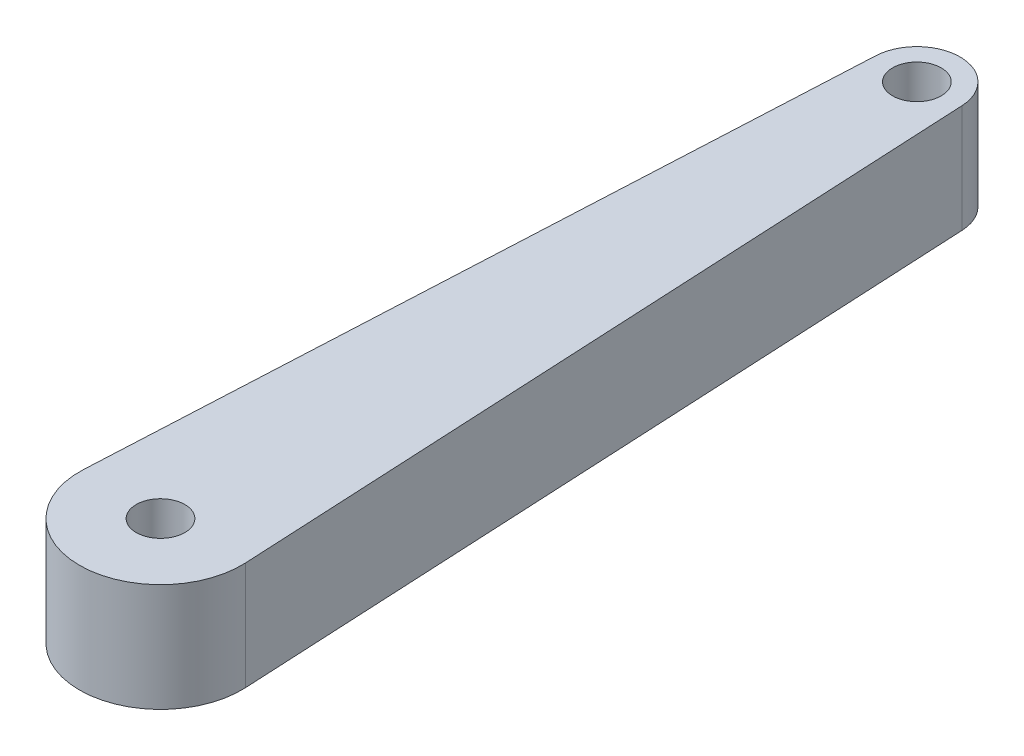
ISO-10303-21;
HEADER;
FILE_DESCRIPTION(('STEP AP214'),'2;1');
FILE_NAME('part.step','',(''),(''),'','','');
FILE_SCHEMA(('AUTOMOTIVE_DESIGN { 1 0 10303 214 1 1 1 1 }'));
ENDSEC;
DATA;
#1=APPLICATION_CONTEXT('core data for automotive mechanical design processes');
#2=APPLICATION_PROTOCOL_DEFINITION('international standard','automotive_design',2000,#1);
#3=PRODUCT_CONTEXT('',#1,'mechanical');
#4=PRODUCT('Part','Part','',(#3));
#5=PRODUCT_RELATED_PRODUCT_CATEGORY('part','',(#4));
#6=PRODUCT_DEFINITION_FORMATION('','',#4);
#7=PRODUCT_DEFINITION_CONTEXT('part definition',#1,'design');
#8=PRODUCT_DEFINITION('design','',#6,#7);
#9=PRODUCT_DEFINITION_SHAPE('','',#8);
#10=(LENGTH_UNIT() NAMED_UNIT(*) SI_UNIT(.MILLI.,.METRE.));
#11=(NAMED_UNIT(*) PLANE_ANGLE_UNIT() SI_UNIT($,.RADIAN.));
#12=(NAMED_UNIT(*) SI_UNIT($,.STERADIAN.) SOLID_ANGLE_UNIT());
#13=UNCERTAINTY_MEASURE_WITH_UNIT(LENGTH_MEASURE(1.E-05),#10,'distance_accuracy_value','');
#14=(GEOMETRIC_REPRESENTATION_CONTEXT(3) GLOBAL_UNCERTAINTY_ASSIGNED_CONTEXT((#13)) GLOBAL_UNIT_ASSIGNED_CONTEXT((#10,
#11,#12)) REPRESENTATION_CONTEXT('',''));
#15=CARTESIAN_POINT('',(0.,0.,0.));
#16=DIRECTION('',(0.,0.,1.));
#17=DIRECTION('',(1.,0.,0.));
#18=AXIS2_PLACEMENT_3D('',#15,#16,#17);
#19=CARTESIAN_POINT('',(-3.74530956664466,5.,-0.1875));
#20=DIRECTION('',(-0.998749217771909,0.,-0.05));
#21=DIRECTION('',(-0.05,0.,0.998749217771909));
#22=AXIS2_PLACEMENT_3D('',#19,#20,#21);
#23=PLANE('',#22);
#24=DIRECTION('',(0.05,0.,-0.998749217771909));
#25=VECTOR('',#24,1.);
#26=CARTESIAN_POINT('',(-3.74530956664466,0.,-0.1875));
#27=LINE('',#26,#25);
#28=CARTESIAN_POINT('',(-3.74530956664466,0.,-0.1875));
#29=VERTEX_POINT('',#28);
#30=CARTESIAN_POINT('',(-1.99749843554382,0.,-35.1));
#31=VERTEX_POINT('',#30);
#32=EDGE_CURVE('E117',#29,#31,#27,.T.);
#33=ORIENTED_EDGE('',*,*,#32,.F.);
#34=DIRECTION('',(0.,-1.,0.));
#35=VECTOR('',#34,1.);
#36=CARTESIAN_POINT('',(-3.74530956664466,5.,-0.1875));
#37=LINE('',#36,#35);
#38=CARTESIAN_POINT('',(-3.74530956664466,5.,-0.1875));
#39=VERTEX_POINT('',#38);
#40=EDGE_CURVE('E11',#39,#29,#37,.T.);
#41=ORIENTED_EDGE('',*,*,#40,.F.);
#42=DIRECTION('',(0.05,0.,-0.998749217771909));
#43=VECTOR('',#42,1.);
#44=CARTESIAN_POINT('',(-3.74530956664466,5.,-0.1875));
#45=LINE('',#44,#43);
#46=CARTESIAN_POINT('',(-1.99749843554382,5.,-35.1));
#47=VERTEX_POINT('',#46);
#48=EDGE_CURVE('E93',#39,#47,#45,.T.);
#49=ORIENTED_EDGE('',*,*,#48,.T.);
#50=DIRECTION('',(0.,-1.,0.));
#51=VECTOR('',#50,1.);
#52=CARTESIAN_POINT('',(-1.99749843554382,5.,-35.1));
#53=LINE('',#52,#51);
#54=EDGE_CURVE('E81',#47,#31,#53,.T.);
#55=ORIENTED_EDGE('',*,*,#54,.T.);
#56=EDGE_LOOP('',(#33,#41,#49,#55));
#57=FACE_BOUND('',#56,.T.);
#58=ADVANCED_FACE('F41',(#57),#23,.T.);
#59=CARTESIAN_POINT('',(0.,5.,0.));
#60=DIRECTION('',(0.,-1.,0.));
#61=DIRECTION('',(0.,0.,-1.));
#62=AXIS2_PLACEMENT_3D('',#59,#60,#61);
#63=CYLINDRICAL_SURFACE('',#62,3.75);
#64=CARTESIAN_POINT('',(0.,0.,0.));
#65=DIRECTION('',(0.,1.,0.));
#66=DIRECTION('',(0.,0.,1.));
#67=AXIS2_PLACEMENT_3D('',#64,#65,#66);
#68=CIRCLE('',#67,3.75);
#69=CARTESIAN_POINT('',(3.74530956664466,0.,-0.1875));
#70=VERTEX_POINT('',#69);
#71=EDGE_CURVE('E99',#29,#70,#68,.T.);
#72=ORIENTED_EDGE('',*,*,#71,.T.);
#73=DIRECTION('',(0.,-1.,0.));
#74=VECTOR('',#73,1.);
#75=CARTESIAN_POINT('',(3.74530956664466,5.,-0.1875));
#76=LINE('',#75,#74);
#77=CARTESIAN_POINT('',(3.74530956664466,5.,-0.1875));
#78=VERTEX_POINT('',#77);
#79=EDGE_CURVE('E50',#78,#70,#76,.T.);
#80=ORIENTED_EDGE('',*,*,#79,.F.);
#81=CARTESIAN_POINT('',(0.,5.,0.));
#82=DIRECTION('',(0.,1.,0.));
#83=DIRECTION('',(0.,0.,1.));
#84=AXIS2_PLACEMENT_3D('',#81,#82,#83);
#85=CIRCLE('',#84,3.75);
#86=EDGE_CURVE('E87',#39,#78,#85,.T.);
#87=ORIENTED_EDGE('',*,*,#86,.F.);
#88=ORIENTED_EDGE('',*,*,#40,.T.);
#89=EDGE_LOOP('',(#72,#80,#87,#88));
#90=FACE_BOUND('',#89,.T.);
#91=ADVANCED_FACE('F97',(#90),#63,.T.);
#92=CARTESIAN_POINT('',(3.74530956664466,5.,-0.1875));
#93=DIRECTION('',(-0.998749217771909,0.,0.05));
#94=DIRECTION('',(0.05,0.,0.998749217771909));
#95=AXIS2_PLACEMENT_3D('',#92,#93,#94);
#96=PLANE('',#95);
#97=DIRECTION('',(-0.05,0.,-0.998749217771909));
#98=VECTOR('',#97,1.);
#99=CARTESIAN_POINT('',(3.74530956664466,0.,-0.1875));
#100=LINE('',#99,#98);
#101=CARTESIAN_POINT('',(1.99749843554382,0.,-35.1));
#102=VERTEX_POINT('',#101);
#103=EDGE_CURVE('E74',#70,#102,#100,.T.);
#104=ORIENTED_EDGE('',*,*,#103,.T.);
#105=DIRECTION('',(0.,-1.,0.));
#106=VECTOR('',#105,1.);
#107=CARTESIAN_POINT('',(1.99749843554382,5.,-35.1));
#108=LINE('',#107,#106);
#109=CARTESIAN_POINT('',(1.99749843554382,5.,-35.1));
#110=VERTEX_POINT('',#109);
#111=EDGE_CURVE('E101',#110,#102,#108,.T.);
#112=ORIENTED_EDGE('',*,*,#111,.F.);
#113=DIRECTION('',(-0.05,0.,-0.998749217771909));
#114=VECTOR('',#113,1.);
#115=CARTESIAN_POINT('',(3.74530956664466,5.,-0.1875));
#116=LINE('',#115,#114);
#117=EDGE_CURVE('E92',#78,#110,#116,.T.);
#118=ORIENTED_EDGE('',*,*,#117,.F.);
#119=ORIENTED_EDGE('',*,*,#79,.T.);
#120=EDGE_LOOP('',(#104,#112,#118,#119));
#121=FACE_BOUND('',#120,.T.);
#122=ADVANCED_FACE('F102',(#121),#96,.F.);
#123=CARTESIAN_POINT('',(0.,5.,-35.));
#124=DIRECTION('',(0.,-1.,0.));
#125=DIRECTION('',(0.,0.,-1.));
#126=AXIS2_PLACEMENT_3D('',#123,#124,#125);
#127=CYLINDRICAL_SURFACE('',#126,1.125);
#128=CARTESIAN_POINT('',(0.,5.,-35.));
#129=DIRECTION('',(0.,1.,0.));
#130=DIRECTION('',(0.,0.,1.));
#131=AXIS2_PLACEMENT_3D('',#128,#129,#130);
#132=CIRCLE('',#131,1.125);
#133=CARTESIAN_POINT('',(0.,5.,-33.875));
#134=VERTEX_POINT('',#133);
#135=EDGE_CURVE('E106',#134,#134,#132,.T.);
#136=ORIENTED_EDGE('',*,*,#135,.T.);
#137=EDGE_LOOP('',(#136));
#138=FACE_BOUND('',#137,.T.);
#139=CARTESIAN_POINT('',(0.,0.,-35.));
#140=DIRECTION('',(0.,1.,0.));
#141=DIRECTION('',(0.,0.,1.));
#142=AXIS2_PLACEMENT_3D('',#139,#140,#141);
#143=CIRCLE('',#142,1.125);
#144=CARTESIAN_POINT('',(0.,0.,-33.875));
#145=VERTEX_POINT('',#144);
#146=EDGE_CURVE('E128',#145,#145,#143,.T.);
#147=ORIENTED_EDGE('',*,*,#146,.F.);
#148=EDGE_LOOP('',(#147));
#149=FACE_BOUND('',#148,.T.);
#150=ADVANCED_FACE('F152',(#138,#149),#127,.F.);
#151=CARTESIAN_POINT('',(0.,5.,-35.));
#152=DIRECTION('',(0.,-1.,0.));
#153=DIRECTION('',(0.,0.,-1.));
#154=AXIS2_PLACEMENT_3D('',#151,#152,#153);
#155=CYLINDRICAL_SURFACE('',#154,2.);
#156=CARTESIAN_POINT('',(0.,0.,-35.));
#157=DIRECTION('',(0.,1.,0.));
#158=DIRECTION('',(0.,0.,1.));
#159=AXIS2_PLACEMENT_3D('',#156,#157,#158);
#160=CIRCLE('',#159,2.);
#161=EDGE_CURVE('E125',#102,#31,#160,.T.);
#162=ORIENTED_EDGE('',*,*,#161,.T.);
#163=ORIENTED_EDGE('',*,*,#54,.F.);
#164=CARTESIAN_POINT('',(0.,5.,-35.));
#165=DIRECTION('',(0.,1.,0.));
#166=DIRECTION('',(0.,0.,1.));
#167=AXIS2_PLACEMENT_3D('',#164,#165,#166);
#168=CIRCLE('',#167,2.);
#169=EDGE_CURVE('E58',#110,#47,#168,.T.);
#170=ORIENTED_EDGE('',*,*,#169,.F.);
#171=ORIENTED_EDGE('',*,*,#111,.T.);
#172=EDGE_LOOP('',(#162,#163,#170,#171));
#173=FACE_BOUND('',#172,.T.);
#174=ADVANCED_FACE('F141',(#173),#155,.T.);
#175=CARTESIAN_POINT('',(0.,5.,0.));
#176=DIRECTION('',(0.,-1.,0.));
#177=DIRECTION('',(0.,0.,-1.));
#178=AXIS2_PLACEMENT_3D('',#175,#176,#177);
#179=CYLINDRICAL_SURFACE('',#178,1.125);
#180=CARTESIAN_POINT('',(0.,5.,0.));
#181=DIRECTION('',(0.,1.,0.));
#182=DIRECTION('',(0.,0.,1.));
#183=AXIS2_PLACEMENT_3D('',#180,#181,#182);
#184=CIRCLE('',#183,1.125);
#185=CARTESIAN_POINT('',(0.,5.,1.125));
#186=VERTEX_POINT('',#185);
#187=EDGE_CURVE('E113',#186,#186,#184,.T.);
#188=ORIENTED_EDGE('',*,*,#187,.T.);
#189=EDGE_LOOP('',(#188));
#190=FACE_BOUND('',#189,.T.);
#191=CARTESIAN_POINT('',(0.,0.,0.));
#192=DIRECTION('',(0.,1.,0.));
#193=DIRECTION('',(0.,0.,1.));
#194=AXIS2_PLACEMENT_3D('',#191,#192,#193);
#195=CIRCLE('',#194,1.125);
#196=CARTESIAN_POINT('',(0.,0.,1.125));
#197=VERTEX_POINT('',#196);
#198=EDGE_CURVE('E132',#197,#197,#195,.T.);
#199=ORIENTED_EDGE('',*,*,#198,.F.);
#200=EDGE_LOOP('',(#199));
#201=FACE_BOUND('',#200,.T.);
#202=ADVANCED_FACE('F157',(#190,#201),#179,.F.);
#203=CARTESIAN_POINT('',(0.,5.,0.));
#204=DIRECTION('',(0.,1.,0.));
#205=DIRECTION('',(0.,0.,1.));
#206=AXIS2_PLACEMENT_3D('',#203,#204,#205);
#207=PLANE('',#206);
#208=ORIENTED_EDGE('',*,*,#48,.F.);
#209=ORIENTED_EDGE('',*,*,#86,.T.);
#210=ORIENTED_EDGE('',*,*,#117,.T.);
#211=ORIENTED_EDGE('',*,*,#169,.T.);
#212=EDGE_LOOP('',(#208,#209,#210,#211));
#213=FACE_BOUND('',#212,.T.);
#214=ORIENTED_EDGE('',*,*,#135,.F.);
#215=EDGE_LOOP('',(#214));
#216=FACE_BOUND('',#215,.T.);
#217=ORIENTED_EDGE('',*,*,#187,.F.);
#218=EDGE_LOOP('',(#217));
#219=FACE_BOUND('',#218,.T.);
#220=ADVANCED_FACE('F89',(#213,#216,#219),#207,.T.);
#221=CARTESIAN_POINT('',(0.,0.,0.));
#222=DIRECTION('',(0.,1.,0.));
#223=DIRECTION('',(0.,0.,1.));
#224=AXIS2_PLACEMENT_3D('',#221,#222,#223);
#225=PLANE('',#224);
#226=ORIENTED_EDGE('',*,*,#32,.T.);
#227=ORIENTED_EDGE('',*,*,#161,.F.);
#228=ORIENTED_EDGE('',*,*,#103,.F.);
#229=ORIENTED_EDGE('',*,*,#71,.F.);
#230=EDGE_LOOP('',(#226,#227,#228,#229));
#231=FACE_BOUND('',#230,.T.);
#232=ORIENTED_EDGE('',*,*,#146,.T.);
#233=EDGE_LOOP('',(#232));
#234=FACE_BOUND('',#233,.T.);
#235=ORIENTED_EDGE('',*,*,#198,.T.);
#236=EDGE_LOOP('',(#235));
#237=FACE_BOUND('',#236,.T.);
#238=ADVANCED_FACE('F143',(#231,#234,#237),#225,.F.);
#239=CLOSED_SHELL('',(#58,#91,#122,#150,#174,#202,#220,#238));
#240=MANIFOLD_SOLID_BREP('B2',#239);
#241=ADVANCED_BREP_SHAPE_REPRESENTATION('',(#18,#240),#14);
#242=SHAPE_DEFINITION_REPRESENTATION(#9,#241);
ENDSEC;
END-ISO-10303-21;
